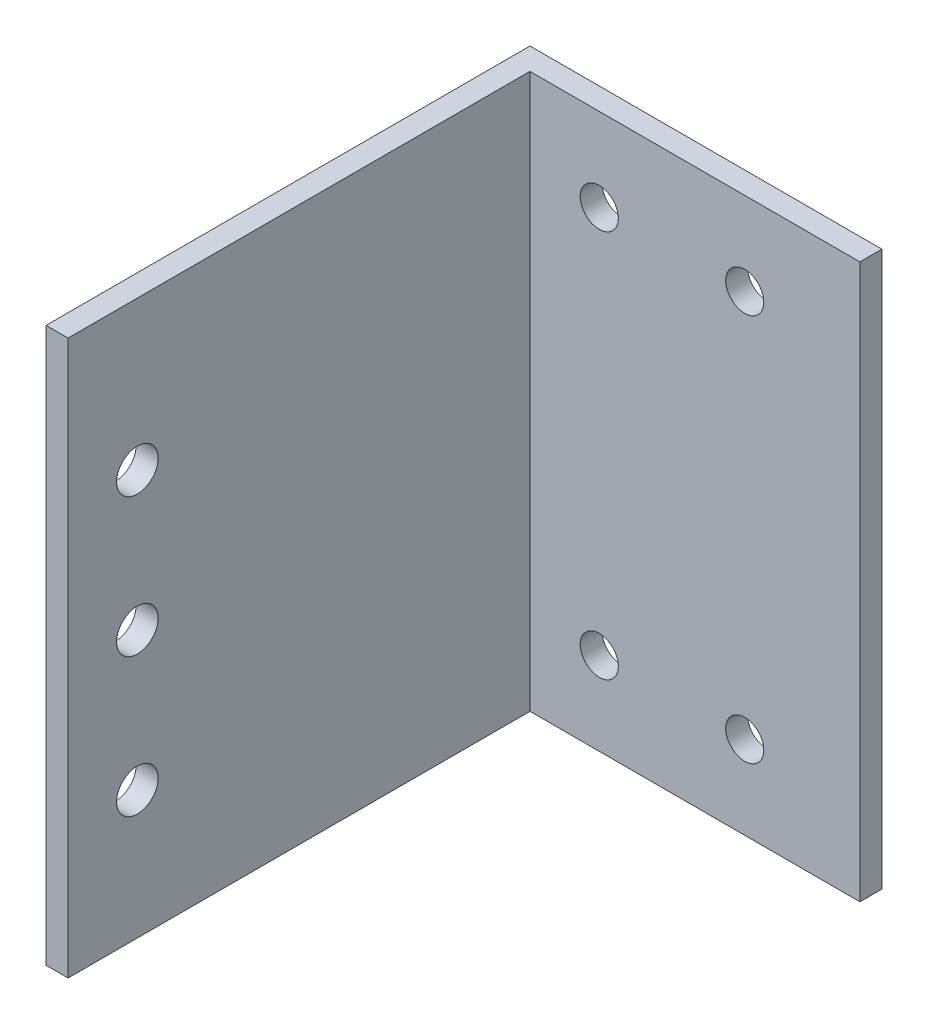
ISO-10303-21;
HEADER;
FILE_DESCRIPTION(('STEP AP214'),'2;1');
FILE_NAME('part.step','',(''),(''),'','','');
FILE_SCHEMA(('AUTOMOTIVE_DESIGN { 1 0 10303 214 1 1 1 1 }'));
ENDSEC;
DATA;
#1=APPLICATION_CONTEXT('core data for automotive mechanical design processes');
#2=APPLICATION_PROTOCOL_DEFINITION('international standard','automotive_design',2000,#1);
#3=PRODUCT_CONTEXT('',#1,'mechanical');
#4=PRODUCT('Part','Part','',(#3));
#5=PRODUCT_RELATED_PRODUCT_CATEGORY('part','',(#4));
#6=PRODUCT_DEFINITION_FORMATION('','',#4);
#7=PRODUCT_DEFINITION_CONTEXT('part definition',#1,'design');
#8=PRODUCT_DEFINITION('design','',#6,#7);
#9=PRODUCT_DEFINITION_SHAPE('','',#8);
#10=(LENGTH_UNIT() NAMED_UNIT(*) SI_UNIT(.MILLI.,.METRE.));
#11=(NAMED_UNIT(*) PLANE_ANGLE_UNIT() SI_UNIT($,.RADIAN.));
#12=(NAMED_UNIT(*) SI_UNIT($,.STERADIAN.) SOLID_ANGLE_UNIT());
#13=UNCERTAINTY_MEASURE_WITH_UNIT(LENGTH_MEASURE(1.E-05),#10,'distance_accuracy_value','');
#14=(GEOMETRIC_REPRESENTATION_CONTEXT(3) GLOBAL_UNCERTAINTY_ASSIGNED_CONTEXT((#13)) GLOBAL_UNIT_ASSIGNED_CONTEXT((#10,
#11,#12)) REPRESENTATION_CONTEXT('',''));
#15=CARTESIAN_POINT('',(0.,0.,0.));
#16=DIRECTION('',(0.,0.,1.));
#17=DIRECTION('',(1.,0.,0.));
#18=AXIS2_PLACEMENT_3D('',#15,#16,#17);
#19=CARTESIAN_POINT('',(0.,0.,3.175));
#20=DIRECTION('',(0.,0.,-1.));
#21=DIRECTION('',(-1.,0.,0.));
#22=AXIS2_PLACEMENT_3D('',#19,#20,#21);
#23=PLANE('',#22);
#24=CARTESIAN_POINT('',(13.175,12.,3.175));
#25=DIRECTION('',(0.,0.,1.));
#26=DIRECTION('',(1.,0.,0.));
#27=AXIS2_PLACEMENT_3D('',#24,#25,#26);
#28=CIRCLE('',#27,2.75);
#29=CARTESIAN_POINT('',(15.925,12.,3.175));
#30=VERTEX_POINT('',#29);
#31=EDGE_CURVE('E194',#30,#30,#28,.T.);
#32=ORIENTED_EDGE('',*,*,#31,.F.);
#33=EDGE_LOOP('',(#32));
#34=FACE_BOUND('',#33,.T.);
#35=CARTESIAN_POINT('',(34.175,68.,3.175));
#36=DIRECTION('',(0.,0.,1.));
#37=DIRECTION('',(1.,0.,0.));
#38=AXIS2_PLACEMENT_3D('',#35,#36,#37);
#39=CIRCLE('',#38,2.75);
#40=CARTESIAN_POINT('',(36.925,68.,3.175));
#41=VERTEX_POINT('',#40);
#42=EDGE_CURVE('E195',#41,#41,#39,.T.);
#43=ORIENTED_EDGE('',*,*,#42,.F.);
#44=EDGE_LOOP('',(#43));
#45=FACE_BOUND('',#44,.T.);
#46=CARTESIAN_POINT('',(34.175,12.,3.175));
#47=DIRECTION('',(0.,0.,1.));
#48=DIRECTION('',(1.,0.,0.));
#49=AXIS2_PLACEMENT_3D('',#46,#47,#48);
#50=CIRCLE('',#49,2.74999999999999);
#51=CARTESIAN_POINT('',(36.925,12.,3.175));
#52=VERTEX_POINT('',#51);
#53=EDGE_CURVE('E199',#52,#52,#50,.T.);
#54=ORIENTED_EDGE('',*,*,#53,.F.);
#55=EDGE_LOOP('',(#54));
#56=FACE_BOUND('',#55,.T.);
#57=CARTESIAN_POINT('',(13.175,68.,3.175));
#58=DIRECTION('',(0.,0.,1.));
#59=DIRECTION('',(1.,0.,0.));
#60=AXIS2_PLACEMENT_3D('',#57,#58,#59);
#61=CIRCLE('',#60,2.75);
#62=CARTESIAN_POINT('',(15.925,68.,3.175));
#63=VERTEX_POINT('',#62);
#64=EDGE_CURVE('E138',#63,#63,#61,.T.);
#65=ORIENTED_EDGE('',*,*,#64,.F.);
#66=EDGE_LOOP('',(#65));
#67=FACE_BOUND('',#66,.T.);
#68=DIRECTION('',(0.,1.,0.));
#69=VECTOR('',#68,1.);
#70=CARTESIAN_POINT('',(3.175,80.,3.175));
#71=LINE('',#70,#69);
#72=CARTESIAN_POINT('',(3.17500000000001,0.,3.175));
#73=VERTEX_POINT('',#72);
#74=CARTESIAN_POINT('',(3.175,80.,3.175));
#75=VERTEX_POINT('',#74);
#76=EDGE_CURVE('E61',#73,#75,#71,.T.);
#77=ORIENTED_EDGE('',*,*,#76,.F.);
#78=DIRECTION('',(1.,0.,0.));
#79=VECTOR('',#78,1.);
#80=CARTESIAN_POINT('',(0.,0.,3.175));
#81=LINE('',#80,#79);
#82=CARTESIAN_POINT('',(50.8,0.,3.175));
#83=VERTEX_POINT('',#82);
#84=EDGE_CURVE('E99',#73,#83,#81,.T.);
#85=ORIENTED_EDGE('',*,*,#84,.T.);
#86=DIRECTION('',(0.,1.,0.));
#87=VECTOR('',#86,1.);
#88=CARTESIAN_POINT('',(50.8,0.,3.175));
#89=LINE('',#88,#87);
#90=CARTESIAN_POINT('',(50.8,80.,3.175));
#91=VERTEX_POINT('',#90);
#92=EDGE_CURVE('E67',#83,#91,#89,.T.);
#93=ORIENTED_EDGE('',*,*,#92,.T.);
#94=DIRECTION('',(-1.,0.,0.));
#95=VECTOR('',#94,1.);
#96=CARTESIAN_POINT('',(0.,80.,3.175));
#97=LINE('',#96,#95);
#98=EDGE_CURVE('E110',#91,#75,#97,.T.);
#99=ORIENTED_EDGE('',*,*,#98,.T.);
#100=EDGE_LOOP('',(#77,#85,#93,#99));
#101=FACE_BOUND('',#100,.T.);
#102=ADVANCED_FACE('F43',(#34,#45,#56,#67,#101),#23,.F.);
#103=CARTESIAN_POINT('',(0.,0.,3.175));
#104=DIRECTION('',(1.,0.,0.));
#105=DIRECTION('',(0.,0.,-1.));
#106=AXIS2_PLACEMENT_3D('',#103,#104,#105);
#107=PLANE('',#106);
#108=CARTESIAN_POINT('',(0.,58.5,59.8500000000001));
#109=DIRECTION('',(1.,0.,0.));
#110=DIRECTION('',(0.,0.,-1.));
#111=AXIS2_PLACEMENT_3D('',#108,#109,#110);
#112=CIRCLE('',#111,3.);
#113=CARTESIAN_POINT('',(0.,58.5,56.8500000000001));
#114=VERTEX_POINT('',#113);
#115=EDGE_CURVE('E206',#114,#114,#112,.T.);
#116=ORIENTED_EDGE('',*,*,#115,.T.);
#117=EDGE_LOOP('',(#116));
#118=FACE_BOUND('',#117,.T.);
#119=CARTESIAN_POINT('',(0.,18.5,59.85));
#120=DIRECTION('',(1.,0.,0.));
#121=DIRECTION('',(0.,0.,-1.));
#122=AXIS2_PLACEMENT_3D('',#119,#120,#121);
#123=CIRCLE('',#122,3.);
#124=CARTESIAN_POINT('',(0.,18.5,56.85));
#125=VERTEX_POINT('',#124);
#126=EDGE_CURVE('E210',#125,#125,#123,.T.);
#127=ORIENTED_EDGE('',*,*,#126,.T.);
#128=EDGE_LOOP('',(#127));
#129=FACE_BOUND('',#128,.T.);
#130=CARTESIAN_POINT('',(0.,38.5,59.8500000000001));
#131=DIRECTION('',(1.,0.,0.));
#132=DIRECTION('',(0.,0.,-1.));
#133=AXIS2_PLACEMENT_3D('',#130,#131,#132);
#134=CIRCLE('',#133,3.);
#135=CARTESIAN_POINT('',(0.,38.5,56.8500000000001));
#136=VERTEX_POINT('',#135);
#137=EDGE_CURVE('E214',#136,#136,#134,.T.);
#138=ORIENTED_EDGE('',*,*,#137,.T.);
#139=EDGE_LOOP('',(#138));
#140=FACE_BOUND('',#139,.T.);
#141=DIRECTION('',(0.,-1.,0.));
#142=VECTOR('',#141,1.);
#143=CARTESIAN_POINT('',(0.,0.,0.));
#144=LINE('',#143,#142);
#145=CARTESIAN_POINT('',(0.,80.,0.));
#146=VERTEX_POINT('',#145);
#147=CARTESIAN_POINT('',(0.,0.,0.));
#148=VERTEX_POINT('',#147);
#149=EDGE_CURVE('E106',#146,#148,#144,.T.);
#150=ORIENTED_EDGE('',*,*,#149,.T.);
#151=DIRECTION('',(0.,0.,-1.));
#152=VECTOR('',#151,1.);
#153=CARTESIAN_POINT('',(0.,0.,3.175));
#154=LINE('',#153,#152);
#155=CARTESIAN_POINT('',(0.,0.,69.85));
#156=VERTEX_POINT('',#155);
#157=EDGE_CURVE('E11',#156,#148,#154,.T.);
#158=ORIENTED_EDGE('',*,*,#157,.F.);
#159=DIRECTION('',(0.,-1.,0.));
#160=VECTOR('',#159,1.);
#161=CARTESIAN_POINT('',(0.,80.,69.85));
#162=LINE('',#161,#160);
#163=CARTESIAN_POINT('',(0.,80.,69.85));
#164=VERTEX_POINT('',#163);
#165=EDGE_CURVE('E108',#164,#156,#162,.T.);
#166=ORIENTED_EDGE('',*,*,#165,.F.);
#167=DIRECTION('',(0.,0.,-1.));
#168=VECTOR('',#167,1.);
#169=CARTESIAN_POINT('',(0.,80.,3.175));
#170=LINE('',#169,#168);
#171=EDGE_CURVE('E91',#164,#146,#170,.T.);
#172=ORIENTED_EDGE('',*,*,#171,.T.);
#173=EDGE_LOOP('',(#150,#158,#166,#172));
#174=FACE_BOUND('',#173,.T.);
#175=ADVANCED_FACE('F45',(#118,#129,#140,#174),#107,.F.);
#176=CARTESIAN_POINT('',(0.,0.,3.175));
#177=DIRECTION('',(0.,1.,0.));
#178=DIRECTION('',(0.,0.,1.));
#179=AXIS2_PLACEMENT_3D('',#176,#177,#178);
#180=PLANE('',#179);
#181=DIRECTION('',(1.,0.,0.));
#182=VECTOR('',#181,1.);
#183=CARTESIAN_POINT('',(0.,0.,0.));
#184=LINE('',#183,#182);
#185=CARTESIAN_POINT('',(50.8,0.,0.));
#186=VERTEX_POINT('',#185);
#187=EDGE_CURVE('E113',#148,#186,#184,.T.);
#188=ORIENTED_EDGE('',*,*,#187,.T.);
#189=DIRECTION('',(0.,0.,-1.));
#190=VECTOR('',#189,1.);
#191=CARTESIAN_POINT('',(50.8,0.,3.175));
#192=LINE('',#191,#190);
#193=EDGE_CURVE('E53',#83,#186,#192,.T.);
#194=ORIENTED_EDGE('',*,*,#193,.F.);
#195=ORIENTED_EDGE('',*,*,#84,.F.);
#196=DIRECTION('',(0.,0.,-1.));
#197=VECTOR('',#196,1.);
#198=CARTESIAN_POINT('',(3.17500000000001,0.,69.85));
#199=LINE('',#198,#197);
#200=CARTESIAN_POINT('',(3.17500000000001,0.,69.85));
#201=VERTEX_POINT('',#200);
#202=EDGE_CURVE('E115',#201,#73,#199,.T.);
#203=ORIENTED_EDGE('',*,*,#202,.F.);
#204=DIRECTION('',(1.,0.,0.));
#205=VECTOR('',#204,1.);
#206=CARTESIAN_POINT('',(0.,0.,69.85));
#207=LINE('',#206,#205);
#208=EDGE_CURVE('E157',#156,#201,#207,.T.);
#209=ORIENTED_EDGE('',*,*,#208,.F.);
#210=ORIENTED_EDGE('',*,*,#157,.T.);
#211=EDGE_LOOP('',(#188,#194,#195,#203,#209,#210));
#212=FACE_BOUND('',#211,.T.);
#213=ADVANCED_FACE('F184',(#212),#180,.F.);
#214=CARTESIAN_POINT('',(50.8,0.,3.175));
#215=DIRECTION('',(-1.,0.,0.));
#216=DIRECTION('',(0.,0.,1.));
#217=AXIS2_PLACEMENT_3D('',#214,#215,#216);
#218=PLANE('',#217);
#219=DIRECTION('',(0.,1.,0.));
#220=VECTOR('',#219,1.);
#221=CARTESIAN_POINT('',(50.8,0.,0.));
#222=LINE('',#221,#220);
#223=CARTESIAN_POINT('',(50.8,80.,0.));
#224=VERTEX_POINT('',#223);
#225=EDGE_CURVE('E100',#186,#224,#222,.T.);
#226=ORIENTED_EDGE('',*,*,#225,.T.);
#227=DIRECTION('',(0.,0.,-1.));
#228=VECTOR('',#227,1.);
#229=CARTESIAN_POINT('',(50.8,80.,3.175));
#230=LINE('',#229,#228);
#231=EDGE_CURVE('E94',#91,#224,#230,.T.);
#232=ORIENTED_EDGE('',*,*,#231,.F.);
#233=ORIENTED_EDGE('',*,*,#92,.F.);
#234=ORIENTED_EDGE('',*,*,#193,.T.);
#235=EDGE_LOOP('',(#226,#232,#233,#234));
#236=FACE_BOUND('',#235,.T.);
#237=ADVANCED_FACE('F253',(#236),#218,.F.);
#238=CARTESIAN_POINT('',(0.,80.,3.175));
#239=DIRECTION('',(0.,-1.,0.));
#240=DIRECTION('',(0.,0.,-1.));
#241=AXIS2_PLACEMENT_3D('',#238,#239,#240);
#242=PLANE('',#241);
#243=DIRECTION('',(-1.,0.,0.));
#244=VECTOR('',#243,1.);
#245=CARTESIAN_POINT('',(0.,80.,0.));
#246=LINE('',#245,#244);
#247=EDGE_CURVE('E87',#224,#146,#246,.T.);
#248=ORIENTED_EDGE('',*,*,#247,.T.);
#249=ORIENTED_EDGE('',*,*,#171,.F.);
#250=DIRECTION('',(-1.,0.,0.));
#251=VECTOR('',#250,1.);
#252=CARTESIAN_POINT('',(0.,80.,69.85));
#253=LINE('',#252,#251);
#254=CARTESIAN_POINT('',(3.175,80.,69.85));
#255=VERTEX_POINT('',#254);
#256=EDGE_CURVE('E161',#255,#164,#253,.T.);
#257=ORIENTED_EDGE('',*,*,#256,.F.);
#258=DIRECTION('',(0.,0.,-1.));
#259=VECTOR('',#258,1.);
#260=CARTESIAN_POINT('',(3.175,80.,69.85));
#261=LINE('',#260,#259);
#262=EDGE_CURVE('E121',#255,#75,#261,.T.);
#263=ORIENTED_EDGE('',*,*,#262,.T.);
#264=ORIENTED_EDGE('',*,*,#98,.F.);
#265=ORIENTED_EDGE('',*,*,#231,.T.);
#266=EDGE_LOOP('',(#248,#249,#257,#263,#264,#265));
#267=FACE_BOUND('',#266,.T.);
#268=ADVANCED_FACE('F89',(#267),#242,.F.);
#269=CARTESIAN_POINT('',(0.,0.,0.));
#270=DIRECTION('',(0.,0.,-1.));
#271=DIRECTION('',(-1.,0.,0.));
#272=AXIS2_PLACEMENT_3D('',#269,#270,#271);
#273=PLANE('',#272);
#274=CARTESIAN_POINT('',(13.175,12.,0.));
#275=DIRECTION('',(0.,0.,-1.));
#276=DIRECTION('',(-1.,0.,0.));
#277=AXIS2_PLACEMENT_3D('',#274,#275,#276);
#278=CIRCLE('',#277,2.75);
#279=CARTESIAN_POINT('',(10.425,12.,0.));
#280=VERTEX_POINT('',#279);
#281=EDGE_CURVE('E47',#280,#280,#278,.T.);
#282=ORIENTED_EDGE('',*,*,#281,.F.);
#283=EDGE_LOOP('',(#282));
#284=FACE_BOUND('',#283,.T.);
#285=CARTESIAN_POINT('',(34.175,68.,0.));
#286=DIRECTION('',(0.,0.,-1.));
#287=DIRECTION('',(-1.,0.,0.));
#288=AXIS2_PLACEMENT_3D('',#285,#286,#287);
#289=CIRCLE('',#288,2.75);
#290=CARTESIAN_POINT('',(31.425,68.,0.));
#291=VERTEX_POINT('',#290);
#292=EDGE_CURVE('E141',#291,#291,#289,.T.);
#293=ORIENTED_EDGE('',*,*,#292,.F.);
#294=EDGE_LOOP('',(#293));
#295=FACE_BOUND('',#294,.T.);
#296=CARTESIAN_POINT('',(34.175,12.,0.));
#297=DIRECTION('',(0.,0.,-1.));
#298=DIRECTION('',(-1.,0.,0.));
#299=AXIS2_PLACEMENT_3D('',#296,#297,#298);
#300=CIRCLE('',#299,2.74999999999999);
#301=CARTESIAN_POINT('',(31.425,12.,0.));
#302=VERTEX_POINT('',#301);
#303=EDGE_CURVE('E137',#302,#302,#300,.T.);
#304=ORIENTED_EDGE('',*,*,#303,.F.);
#305=EDGE_LOOP('',(#304));
#306=FACE_BOUND('',#305,.T.);
#307=CARTESIAN_POINT('',(13.175,68.,0.));
#308=DIRECTION('',(0.,0.,-1.));
#309=DIRECTION('',(-1.,0.,0.));
#310=AXIS2_PLACEMENT_3D('',#307,#308,#309);
#311=CIRCLE('',#310,2.75);
#312=CARTESIAN_POINT('',(10.425,68.,0.));
#313=VERTEX_POINT('',#312);
#314=EDGE_CURVE('E133',#313,#313,#311,.T.);
#315=ORIENTED_EDGE('',*,*,#314,.F.);
#316=EDGE_LOOP('',(#315));
#317=FACE_BOUND('',#316,.T.);
#318=ORIENTED_EDGE('',*,*,#149,.F.);
#319=ORIENTED_EDGE('',*,*,#247,.F.);
#320=ORIENTED_EDGE('',*,*,#225,.F.);
#321=ORIENTED_EDGE('',*,*,#187,.F.);
#322=EDGE_LOOP('',(#318,#319,#320,#321));
#323=FACE_BOUND('',#322,.T.);
#324=ADVANCED_FACE('F112',(#284,#295,#306,#317,#323),#273,.T.);
#325=CARTESIAN_POINT('',(3.175,80.,69.85));
#326=DIRECTION('',(-1.,0.,0.));
#327=DIRECTION('',(0.,-1.,0.));
#328=AXIS2_PLACEMENT_3D('',#325,#326,#327);
#329=PLANE('',#328);
#330=CARTESIAN_POINT('',(3.175,58.5,59.8500000000001));
#331=DIRECTION('',(1.,0.,0.));
#332=DIRECTION('',(0.,1.,0.));
#333=AXIS2_PLACEMENT_3D('',#330,#331,#332);
#334=CIRCLE('',#333,3.);
#335=CARTESIAN_POINT('',(3.175,61.5,59.8500000000001));
#336=VERTEX_POINT('',#335);
#337=EDGE_CURVE('E223',#336,#336,#334,.T.);
#338=ORIENTED_EDGE('',*,*,#337,.F.);
#339=EDGE_LOOP('',(#338));
#340=FACE_BOUND('',#339,.T.);
#341=CARTESIAN_POINT('',(3.17500000000001,18.5,59.85));
#342=DIRECTION('',(1.,0.,0.));
#343=DIRECTION('',(0.,1.,0.));
#344=AXIS2_PLACEMENT_3D('',#341,#342,#343);
#345=CIRCLE('',#344,3.);
#346=CARTESIAN_POINT('',(3.17500000000001,21.5,59.85));
#347=VERTEX_POINT('',#346);
#348=EDGE_CURVE('E222',#347,#347,#345,.T.);
#349=ORIENTED_EDGE('',*,*,#348,.F.);
#350=EDGE_LOOP('',(#349));
#351=FACE_BOUND('',#350,.T.);
#352=CARTESIAN_POINT('',(3.17500000000001,38.5,59.8500000000001));
#353=DIRECTION('',(1.,0.,0.));
#354=DIRECTION('',(0.,1.,0.));
#355=AXIS2_PLACEMENT_3D('',#352,#353,#354);
#356=CIRCLE('',#355,3.);
#357=CARTESIAN_POINT('',(3.175,41.5,59.8500000000001));
#358=VERTEX_POINT('',#357);
#359=EDGE_CURVE('E218',#358,#358,#356,.T.);
#360=ORIENTED_EDGE('',*,*,#359,.F.);
#361=EDGE_LOOP('',(#360));
#362=FACE_BOUND('',#361,.T.);
#363=ORIENTED_EDGE('',*,*,#76,.T.);
#364=ORIENTED_EDGE('',*,*,#262,.F.);
#365=DIRECTION('',(0.,1.,0.));
#366=VECTOR('',#365,1.);
#367=CARTESIAN_POINT('',(3.175,80.,69.85));
#368=LINE('',#367,#366);
#369=EDGE_CURVE('E174',#201,#255,#368,.T.);
#370=ORIENTED_EDGE('',*,*,#369,.F.);
#371=ORIENTED_EDGE('',*,*,#202,.T.);
#372=EDGE_LOOP('',(#363,#364,#370,#371));
#373=FACE_BOUND('',#372,.T.);
#374=ADVANCED_FACE('F171',(#340,#351,#362,#373),#329,.F.);
#375=CARTESIAN_POINT('',(0.,0.,69.85));
#376=DIRECTION('',(0.,0.,1.));
#377=DIRECTION('',(1.,0.,0.));
#378=AXIS2_PLACEMENT_3D('',#375,#376,#377);
#379=PLANE('',#378);
#380=ORIENTED_EDGE('',*,*,#165,.T.);
#381=ORIENTED_EDGE('',*,*,#208,.T.);
#382=ORIENTED_EDGE('',*,*,#369,.T.);
#383=ORIENTED_EDGE('',*,*,#256,.T.);
#384=EDGE_LOOP('',(#380,#381,#382,#383));
#385=FACE_BOUND('',#384,.T.);
#386=ADVANCED_FACE('F187',(#385),#379,.T.);
#387=CARTESIAN_POINT('',(13.175,68.,-44.45));
#388=DIRECTION('',(0.,0.,1.));
#389=DIRECTION('',(1.,0.,0.));
#390=AXIS2_PLACEMENT_3D('',#387,#388,#389);
#391=CYLINDRICAL_SURFACE('',#390,2.75);
#392=ORIENTED_EDGE('',*,*,#314,.T.);
#393=EDGE_LOOP('',(#392));
#394=FACE_BOUND('',#393,.T.);
#395=ORIENTED_EDGE('',*,*,#64,.T.);
#396=EDGE_LOOP('',(#395));
#397=FACE_BOUND('',#396,.T.);
#398=ADVANCED_FACE('F272',(#394,#397),#391,.F.);
#399=CARTESIAN_POINT('',(34.175,12.,-44.45));
#400=DIRECTION('',(0.,0.,1.));
#401=DIRECTION('',(1.,0.,0.));
#402=AXIS2_PLACEMENT_3D('',#399,#400,#401);
#403=CYLINDRICAL_SURFACE('',#402,2.74999999999999);
#404=ORIENTED_EDGE('',*,*,#303,.T.);
#405=EDGE_LOOP('',(#404));
#406=FACE_BOUND('',#405,.T.);
#407=ORIENTED_EDGE('',*,*,#53,.T.);
#408=EDGE_LOOP('',(#407));
#409=FACE_BOUND('',#408,.T.);
#410=ADVANCED_FACE('F268',(#406,#409),#403,.F.);
#411=CARTESIAN_POINT('',(34.175,68.,-44.45));
#412=DIRECTION('',(0.,0.,1.));
#413=DIRECTION('',(1.,0.,0.));
#414=AXIS2_PLACEMENT_3D('',#411,#412,#413);
#415=CYLINDRICAL_SURFACE('',#414,2.75);
#416=ORIENTED_EDGE('',*,*,#292,.T.);
#417=EDGE_LOOP('',(#416));
#418=FACE_BOUND('',#417,.T.);
#419=ORIENTED_EDGE('',*,*,#42,.T.);
#420=EDGE_LOOP('',(#419));
#421=FACE_BOUND('',#420,.T.);
#422=ADVANCED_FACE('F271',(#418,#421),#415,.F.);
#423=CARTESIAN_POINT('',(13.175,12.,-44.45));
#424=DIRECTION('',(0.,0.,1.));
#425=DIRECTION('',(1.,0.,0.));
#426=AXIS2_PLACEMENT_3D('',#423,#424,#425);
#427=CYLINDRICAL_SURFACE('',#426,2.75);
#428=ORIENTED_EDGE('',*,*,#281,.T.);
#429=EDGE_LOOP('',(#428));
#430=FACE_BOUND('',#429,.T.);
#431=ORIENTED_EDGE('',*,*,#31,.T.);
#432=EDGE_LOOP('',(#431));
#433=FACE_BOUND('',#432,.T.);
#434=ADVANCED_FACE('F243',(#430,#433),#427,.F.);
#435=CARTESIAN_POINT('',(-44.45,38.5,59.8500000000001));
#436=DIRECTION('',(1.,0.,0.));
#437=DIRECTION('',(0.,1.,0.));
#438=AXIS2_PLACEMENT_3D('',#435,#436,#437);
#439=CYLINDRICAL_SURFACE('',#438,3.);
#440=ORIENTED_EDGE('',*,*,#359,.T.);
#441=EDGE_LOOP('',(#440));
#442=FACE_BOUND('',#441,.T.);
#443=ORIENTED_EDGE('',*,*,#137,.F.);
#444=EDGE_LOOP('',(#443));
#445=FACE_BOUND('',#444,.T.);
#446=ADVANCED_FACE('F240',(#442,#445),#439,.F.);
#447=CARTESIAN_POINT('',(-44.45,18.5,59.85));
#448=DIRECTION('',(1.,0.,0.));
#449=DIRECTION('',(0.,1.,0.));
#450=AXIS2_PLACEMENT_3D('',#447,#448,#449);
#451=CYLINDRICAL_SURFACE('',#450,3.);
#452=ORIENTED_EDGE('',*,*,#348,.T.);
#453=EDGE_LOOP('',(#452));
#454=FACE_BOUND('',#453,.T.);
#455=ORIENTED_EDGE('',*,*,#126,.F.);
#456=EDGE_LOOP('',(#455));
#457=FACE_BOUND('',#456,.T.);
#458=ADVANCED_FACE('F231',(#454,#457),#451,.F.);
#459=CARTESIAN_POINT('',(-44.45,58.5,59.8500000000001));
#460=DIRECTION('',(1.,0.,0.));
#461=DIRECTION('',(0.,1.,0.));
#462=AXIS2_PLACEMENT_3D('',#459,#460,#461);
#463=CYLINDRICAL_SURFACE('',#462,3.);
#464=ORIENTED_EDGE('',*,*,#337,.T.);
#465=EDGE_LOOP('',(#464));
#466=FACE_BOUND('',#465,.T.);
#467=ORIENTED_EDGE('',*,*,#115,.F.);
#468=EDGE_LOOP('',(#467));
#469=FACE_BOUND('',#468,.T.);
#470=ADVANCED_FACE('F260',(#466,#469),#463,.F.);
#471=CLOSED_SHELL('',(#102,#175,#213,#237,#268,#324,#374,#386,#398,#410,#422,#434,#446,#458,#470));
#472=MANIFOLD_SOLID_BREP('B2',#471);
#473=ADVANCED_BREP_SHAPE_REPRESENTATION('',(#18,#472),#14);
#474=SHAPE_DEFINITION_REPRESENTATION(#9,#473);
ENDSEC;
END-ISO-10303-21;
